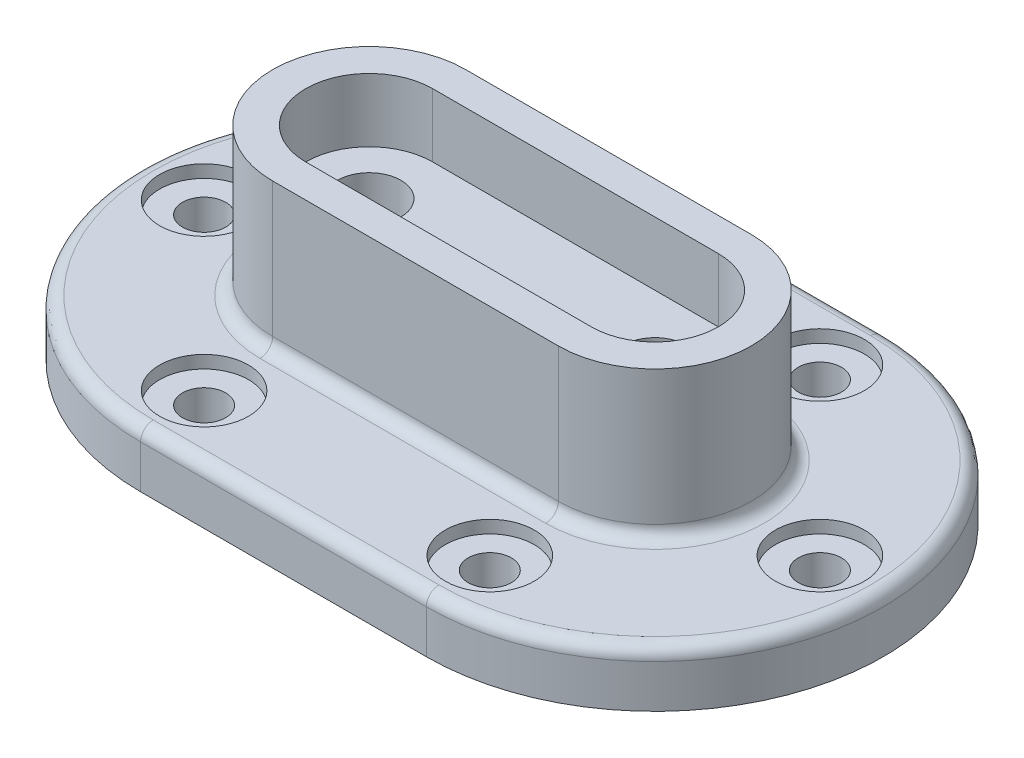
ISO-10303-21;
HEADER;
FILE_DESCRIPTION(('STEP AP214'),'2;1');
FILE_NAME('part.step','',(''),(''),'','','');
FILE_SCHEMA(('AUTOMOTIVE_DESIGN { 1 0 10303 214 1 1 1 1 }'));
ENDSEC;
DATA;
#1=APPLICATION_CONTEXT('core data for automotive mechanical design processes');
#2=APPLICATION_PROTOCOL_DEFINITION('international standard','automotive_design',2000,#1);
#3=PRODUCT_CONTEXT('',#1,'mechanical');
#4=PRODUCT('Part','Part','',(#3));
#5=PRODUCT_RELATED_PRODUCT_CATEGORY('part','',(#4));
#6=PRODUCT_DEFINITION_FORMATION('','',#4);
#7=PRODUCT_DEFINITION_CONTEXT('part definition',#1,'design');
#8=PRODUCT_DEFINITION('design','',#6,#7);
#9=PRODUCT_DEFINITION_SHAPE('','',#8);
#10=(LENGTH_UNIT() NAMED_UNIT(*) SI_UNIT(.MILLI.,.METRE.));
#11=(NAMED_UNIT(*) PLANE_ANGLE_UNIT() SI_UNIT($,.RADIAN.));
#12=(NAMED_UNIT(*) SI_UNIT($,.STERADIAN.) SOLID_ANGLE_UNIT());
#13=UNCERTAINTY_MEASURE_WITH_UNIT(LENGTH_MEASURE(1.E-05),#10,'distance_accuracy_value','');
#14=(GEOMETRIC_REPRESENTATION_CONTEXT(3) GLOBAL_UNCERTAINTY_ASSIGNED_CONTEXT((#13)) GLOBAL_UNIT_ASSIGNED_CONTEXT((#10,
#11,#12)) REPRESENTATION_CONTEXT('',''));
#15=CARTESIAN_POINT('',(0.,0.,0.));
#16=DIRECTION('',(0.,0.,1.));
#17=DIRECTION('',(1.,0.,0.));
#18=AXIS2_PLACEMENT_3D('',#15,#16,#17);
#19=CARTESIAN_POINT('',(-11.25,4.4,0.));
#20=DIRECTION('',(0.,1.,0.));
#21=DIRECTION('',(0.,0.,1.));
#22=AXIS2_PLACEMENT_3D('',#19,#20,#21);
#23=PLANE('',#22);
#24=DIRECTION('',(1.,0.,0.));
#25=VECTOR('',#24,1.);
#26=CARTESIAN_POINT('',(-11.25,4.4,8.6));
#27=LINE('',#26,#25);
#28=CARTESIAN_POINT('',(11.25,4.4,8.6));
#29=VERTEX_POINT('',#28);
#30=CARTESIAN_POINT('',(-11.25,4.4,8.6));
#31=VERTEX_POINT('',#30);
#32=EDGE_CURVE('E318',#29,#31,#27,.F.);
#33=ORIENTED_EDGE('',*,*,#32,.T.);
#34=CARTESIAN_POINT('',(-11.25,4.4,0.));
#35=DIRECTION('',(0.,1.,0.));
#36=DIRECTION('',(0.,0.,1.));
#37=AXIS2_PLACEMENT_3D('',#34,#35,#36);
#38=CIRCLE('',#37,8.6);
#39=CARTESIAN_POINT('',(-11.25,4.4,-8.6));
#40=VERTEX_POINT('',#39);
#41=EDGE_CURVE('E324',#31,#40,#38,.F.);
#42=ORIENTED_EDGE('',*,*,#41,.T.);
#43=DIRECTION('',(-1.,0.,0.));
#44=VECTOR('',#43,1.);
#45=CARTESIAN_POINT('',(-11.25,4.4,-8.6));
#46=LINE('',#45,#44);
#47=CARTESIAN_POINT('',(11.25,4.4,-8.6));
#48=VERTEX_POINT('',#47);
#49=EDGE_CURVE('E322',#40,#48,#46,.F.);
#50=ORIENTED_EDGE('',*,*,#49,.T.);
#51=CARTESIAN_POINT('',(11.25,4.4,0.));
#52=DIRECTION('',(0.,1.,0.));
#53=DIRECTION('',(0.,0.,1.));
#54=AXIS2_PLACEMENT_3D('',#51,#52,#53);
#55=CIRCLE('',#54,8.6);
#56=EDGE_CURVE('E320',#48,#29,#55,.F.);
#57=ORIENTED_EDGE('',*,*,#56,.T.);
#58=EDGE_LOOP('',(#33,#42,#50,#57));
#59=FACE_BOUND('',#58,.T.);
#60=DIRECTION('',(-1.,0.,0.));
#61=VECTOR('',#60,1.);
#62=CARTESIAN_POINT('',(-11.25,4.4,-17.));
#63=LINE('',#62,#61);
#64=CARTESIAN_POINT('',(11.25,4.4,-17.));
#65=VERTEX_POINT('',#64);
#66=CARTESIAN_POINT('',(-11.25,4.4,-17.));
#67=VERTEX_POINT('',#66);
#68=EDGE_CURVE('E313',#65,#67,#63,.T.);
#69=ORIENTED_EDGE('',*,*,#68,.T.);
#70=CARTESIAN_POINT('',(-11.25,4.4,0.));
#71=DIRECTION('',(0.,1.,0.));
#72=DIRECTION('',(0.,0.,1.));
#73=AXIS2_PLACEMENT_3D('',#70,#71,#72);
#74=CIRCLE('',#73,17.);
#75=CARTESIAN_POINT('',(-11.25,4.4,17.));
#76=VERTEX_POINT('',#75);
#77=EDGE_CURVE('E315',#67,#76,#74,.T.);
#78=ORIENTED_EDGE('',*,*,#77,.T.);
#79=DIRECTION('',(1.,0.,0.));
#80=VECTOR('',#79,1.);
#81=CARTESIAN_POINT('',(11.25,4.4,17.));
#82=LINE('',#81,#80);
#83=CARTESIAN_POINT('',(11.25,4.4,17.));
#84=VERTEX_POINT('',#83);
#85=EDGE_CURVE('E309',#76,#84,#82,.T.);
#86=ORIENTED_EDGE('',*,*,#85,.T.);
#87=CARTESIAN_POINT('',(11.25,4.4,0.));
#88=DIRECTION('',(0.,1.,0.));
#89=DIRECTION('',(0.,0.,1.));
#90=AXIS2_PLACEMENT_3D('',#87,#88,#89);
#91=CIRCLE('',#90,17.);
#92=EDGE_CURVE('E311',#84,#65,#91,.T.);
#93=ORIENTED_EDGE('',*,*,#92,.T.);
#94=EDGE_LOOP('',(#69,#78,#86,#93));
#95=FACE_BOUND('',#94,.T.);
#96=CARTESIAN_POINT('',(-11.25,4.4,-13.));
#97=DIRECTION('',(0.,1.,0.));
#98=DIRECTION('',(0.,0.,1.));
#99=AXIS2_PLACEMENT_3D('',#96,#97,#98);
#100=CIRCLE('',#99,3.5);
#101=CARTESIAN_POINT('',(-11.25,4.4,-9.5));
#102=VERTEX_POINT('',#101);
#103=EDGE_CURVE('E235',#102,#102,#100,.T.);
#104=ORIENTED_EDGE('',*,*,#103,.F.);
#105=EDGE_LOOP('',(#104));
#106=FACE_BOUND('',#105,.T.);
#107=CARTESIAN_POINT('',(11.25,4.4,-13.));
#108=DIRECTION('',(0.,1.,0.));
#109=DIRECTION('',(0.,0.,1.));
#110=AXIS2_PLACEMENT_3D('',#107,#108,#109);
#111=CIRCLE('',#110,3.5);
#112=CARTESIAN_POINT('',(11.25,4.4,-9.5));
#113=VERTEX_POINT('',#112);
#114=EDGE_CURVE('E242',#113,#113,#111,.T.);
#115=ORIENTED_EDGE('',*,*,#114,.F.);
#116=EDGE_LOOP('',(#115));
#117=FACE_BOUND('',#116,.T.);
#118=CARTESIAN_POINT('',(24.25,4.4,0.));
#119=DIRECTION('',(0.,1.,0.));
#120=DIRECTION('',(0.,0.,1.));
#121=AXIS2_PLACEMENT_3D('',#118,#119,#120);
#122=CIRCLE('',#121,3.5);
#123=CARTESIAN_POINT('',(24.25,4.4,3.5));
#124=VERTEX_POINT('',#123);
#125=EDGE_CURVE('E248',#124,#124,#122,.T.);
#126=ORIENTED_EDGE('',*,*,#125,.F.);
#127=EDGE_LOOP('',(#126));
#128=FACE_BOUND('',#127,.T.);
#129=CARTESIAN_POINT('',(11.2500000000001,4.4,13.));
#130=DIRECTION('',(0.,1.,0.));
#131=DIRECTION('',(0.,0.,1.));
#132=AXIS2_PLACEMENT_3D('',#129,#130,#131);
#133=CIRCLE('',#132,3.5);
#134=CARTESIAN_POINT('',(11.2500000000001,4.4,16.5));
#135=VERTEX_POINT('',#134);
#136=EDGE_CURVE('E254',#135,#135,#133,.T.);
#137=ORIENTED_EDGE('',*,*,#136,.F.);
#138=EDGE_LOOP('',(#137));
#139=FACE_BOUND('',#138,.T.);
#140=CARTESIAN_POINT('',(-11.2499999999999,4.4,13.));
#141=DIRECTION('',(0.,1.,0.));
#142=DIRECTION('',(0.,0.,1.));
#143=AXIS2_PLACEMENT_3D('',#140,#141,#142);
#144=CIRCLE('',#143,3.5);
#145=CARTESIAN_POINT('',(-11.2499999999999,4.4,16.5));
#146=VERTEX_POINT('',#145);
#147=EDGE_CURVE('E260',#146,#146,#144,.T.);
#148=ORIENTED_EDGE('',*,*,#147,.F.);
#149=EDGE_LOOP('',(#148));
#150=FACE_BOUND('',#149,.T.);
#151=CARTESIAN_POINT('',(-24.25,4.4,0.));
#152=DIRECTION('',(0.,1.,0.));
#153=DIRECTION('',(0.,0.,1.));
#154=AXIS2_PLACEMENT_3D('',#151,#152,#153);
#155=CIRCLE('',#154,3.5);
#156=CARTESIAN_POINT('',(-24.25,4.4,3.5));
#157=VERTEX_POINT('',#156);
#158=EDGE_CURVE('E238',#157,#157,#155,.T.);
#159=ORIENTED_EDGE('',*,*,#158,.F.);
#160=EDGE_LOOP('',(#159));
#161=FACE_BOUND('',#160,.T.);
#162=ADVANCED_FACE('F35',(#59,#95,#106,#117,#128,#139,#150,#161),#23,.T.);
#163=CARTESIAN_POINT('',(-11.25,4.4,0.));
#164=DIRECTION('',(0.,-1.,0.));
#165=DIRECTION('',(0.,0.,-1.));
#166=AXIS2_PLACEMENT_3D('',#163,#164,#165);
#167=CYLINDRICAL_SURFACE('',#166,18.);
#168=DIRECTION('',(0.,-1.,0.));
#169=VECTOR('',#168,1.);
#170=CARTESIAN_POINT('',(-11.25,4.4,18.));
#171=LINE('',#170,#169);
#172=CARTESIAN_POINT('',(-11.25,3.4,18.));
#173=VERTEX_POINT('',#172);
#174=CARTESIAN_POINT('',(-11.25,0.,18.));
#175=VERTEX_POINT('',#174);
#176=EDGE_CURVE('E289',#173,#175,#171,.T.);
#177=ORIENTED_EDGE('',*,*,#176,.F.);
#178=CARTESIAN_POINT('',(-11.25,3.4,0.));
#179=DIRECTION('',(0.,1.,0.));
#180=DIRECTION('',(0.,0.,1.));
#181=AXIS2_PLACEMENT_3D('',#178,#179,#180);
#182=CIRCLE('',#181,18.);
#183=CARTESIAN_POINT('',(-11.25,3.4,-18.));
#184=VERTEX_POINT('',#183);
#185=EDGE_CURVE('E331',#173,#184,#182,.F.);
#186=ORIENTED_EDGE('',*,*,#185,.T.);
#187=DIRECTION('',(0.,-1.,0.));
#188=VECTOR('',#187,1.);
#189=CARTESIAN_POINT('',(-11.25,4.4,-18.));
#190=LINE('',#189,#188);
#191=CARTESIAN_POINT('',(-11.25,0.,-18.));
#192=VERTEX_POINT('',#191);
#193=EDGE_CURVE('E283',#184,#192,#190,.T.);
#194=ORIENTED_EDGE('',*,*,#193,.T.);
#195=CARTESIAN_POINT('',(-11.25,0.,0.));
#196=DIRECTION('',(0.,1.,0.));
#197=DIRECTION('',(0.,0.,1.));
#198=AXIS2_PLACEMENT_3D('',#195,#196,#197);
#199=CIRCLE('',#198,18.);
#200=EDGE_CURVE('E269',#192,#175,#199,.T.);
#201=ORIENTED_EDGE('',*,*,#200,.T.);
#202=EDGE_LOOP('',(#177,#186,#194,#201));
#203=FACE_BOUND('',#202,.T.);
#204=ADVANCED_FACE('F372',(#203),#167,.T.);
#205=CARTESIAN_POINT('',(-11.25,4.4,18.));
#206=DIRECTION('',(0.,0.,-1.));
#207=DIRECTION('',(-1.,0.,0.));
#208=AXIS2_PLACEMENT_3D('',#205,#206,#207);
#209=PLANE('',#208);
#210=DIRECTION('',(0.,-1.,0.));
#211=VECTOR('',#210,1.);
#212=CARTESIAN_POINT('',(11.25,4.4,18.));
#213=LINE('',#212,#211);
#214=CARTESIAN_POINT('',(11.25,3.4,18.));
#215=VERTEX_POINT('',#214);
#216=CARTESIAN_POINT('',(11.25,0.,18.));
#217=VERTEX_POINT('',#216);
#218=EDGE_CURVE('E287',#215,#217,#213,.T.);
#219=ORIENTED_EDGE('',*,*,#218,.F.);
#220=DIRECTION('',(1.,0.,0.));
#221=VECTOR('',#220,1.);
#222=CARTESIAN_POINT('',(-11.25,3.4,18.));
#223=LINE('',#222,#221);
#224=EDGE_CURVE('E11',#215,#173,#223,.F.);
#225=ORIENTED_EDGE('',*,*,#224,.T.);
#226=ORIENTED_EDGE('',*,*,#176,.T.);
#227=DIRECTION('',(1.,0.,0.));
#228=VECTOR('',#227,1.);
#229=CARTESIAN_POINT('',(-11.25,0.,18.));
#230=LINE('',#229,#228);
#231=EDGE_CURVE('E274',#175,#217,#230,.T.);
#232=ORIENTED_EDGE('',*,*,#231,.T.);
#233=EDGE_LOOP('',(#219,#225,#226,#232));
#234=FACE_BOUND('',#233,.T.);
#235=ADVANCED_FACE('F368',(#234),#209,.F.);
#236=CARTESIAN_POINT('',(11.25,4.4,0.));
#237=DIRECTION('',(0.,-1.,0.));
#238=DIRECTION('',(0.,0.,-1.));
#239=AXIS2_PLACEMENT_3D('',#236,#237,#238);
#240=CYLINDRICAL_SURFACE('',#239,18.);
#241=DIRECTION('',(0.,-1.,0.));
#242=VECTOR('',#241,1.);
#243=CARTESIAN_POINT('',(11.25,4.4,-18.));
#244=LINE('',#243,#242);
#245=CARTESIAN_POINT('',(11.25,3.4,-18.));
#246=VERTEX_POINT('',#245);
#247=CARTESIAN_POINT('',(11.25,0.,-18.));
#248=VERTEX_POINT('',#247);
#249=EDGE_CURVE('E285',#246,#248,#244,.T.);
#250=ORIENTED_EDGE('',*,*,#249,.F.);
#251=CARTESIAN_POINT('',(11.25,3.4,0.));
#252=DIRECTION('',(0.,1.,0.));
#253=DIRECTION('',(0.,0.,1.));
#254=AXIS2_PLACEMENT_3D('',#251,#252,#253);
#255=CIRCLE('',#254,18.);
#256=EDGE_CURVE('E60',#246,#215,#255,.F.);
#257=ORIENTED_EDGE('',*,*,#256,.T.);
#258=ORIENTED_EDGE('',*,*,#218,.T.);
#259=CARTESIAN_POINT('',(11.25,0.,0.));
#260=DIRECTION('',(0.,1.,0.));
#261=DIRECTION('',(0.,0.,1.));
#262=AXIS2_PLACEMENT_3D('',#259,#260,#261);
#263=CIRCLE('',#262,18.);
#264=EDGE_CURVE('E277',#217,#248,#263,.T.);
#265=ORIENTED_EDGE('',*,*,#264,.T.);
#266=EDGE_LOOP('',(#250,#257,#258,#265));
#267=FACE_BOUND('',#266,.T.);
#268=ADVANCED_FACE('F416',(#267),#240,.T.);
#269=CARTESIAN_POINT('',(-11.25,4.4,-18.));
#270=DIRECTION('',(0.,0.,1.));
#271=DIRECTION('',(1.,0.,0.));
#272=AXIS2_PLACEMENT_3D('',#269,#270,#271);
#273=PLANE('',#272);
#274=ORIENTED_EDGE('',*,*,#193,.F.);
#275=DIRECTION('',(-1.,0.,0.));
#276=VECTOR('',#275,1.);
#277=CARTESIAN_POINT('',(11.25,3.4,-18.));
#278=LINE('',#277,#276);
#279=EDGE_CURVE('E334',#184,#246,#278,.F.);
#280=ORIENTED_EDGE('',*,*,#279,.T.);
#281=ORIENTED_EDGE('',*,*,#249,.T.);
#282=DIRECTION('',(-1.,0.,0.));
#283=VECTOR('',#282,1.);
#284=CARTESIAN_POINT('',(-11.25,0.,-18.));
#285=LINE('',#284,#283);
#286=EDGE_CURVE('E280',#248,#192,#285,.T.);
#287=ORIENTED_EDGE('',*,*,#286,.T.);
#288=EDGE_LOOP('',(#274,#280,#281,#287));
#289=FACE_BOUND('',#288,.T.);
#290=ADVANCED_FACE('F408',(#289),#273,.F.);
#291=CARTESIAN_POINT('',(-11.25,0.,0.));
#292=DIRECTION('',(0.,1.,0.));
#293=DIRECTION('',(0.,0.,1.));
#294=AXIS2_PLACEMENT_3D('',#291,#292,#293);
#295=PLANE('',#294);
#296=CARTESIAN_POINT('',(11.25,0.,0.));
#297=DIRECTION('',(0.,1.,0.));
#298=DIRECTION('',(0.,0.,1.));
#299=AXIS2_PLACEMENT_3D('',#296,#297,#298);
#300=CIRCLE('',#299,2.5);
#301=CARTESIAN_POINT('',(11.25,0.,2.5));
#302=VERTEX_POINT('',#301);
#303=EDGE_CURVE('E787',#302,#302,#300,.F.);
#304=ORIENTED_EDGE('',*,*,#303,.F.);
#305=EDGE_LOOP('',(#304));
#306=FACE_BOUND('',#305,.T.);
#307=CARTESIAN_POINT('',(-11.25,0.,0.));
#308=DIRECTION('',(0.,1.,0.));
#309=DIRECTION('',(0.,0.,1.));
#310=AXIS2_PLACEMENT_3D('',#307,#308,#309);
#311=CIRCLE('',#310,2.5);
#312=CARTESIAN_POINT('',(-11.25,0.,2.5));
#313=VERTEX_POINT('',#312);
#314=EDGE_CURVE('E176',#313,#313,#311,.F.);
#315=ORIENTED_EDGE('',*,*,#314,.F.);
#316=EDGE_LOOP('',(#315));
#317=FACE_BOUND('',#316,.T.);
#318=CARTESIAN_POINT('',(-11.25,0.,-13.));
#319=DIRECTION('',(0.,1.,0.));
#320=DIRECTION('',(0.,0.,1.));
#321=AXIS2_PLACEMENT_3D('',#318,#319,#320);
#322=CIRCLE('',#321,1.7);
#323=CARTESIAN_POINT('',(-11.25,0.,-11.3));
#324=VERTEX_POINT('',#323);
#325=EDGE_CURVE('E215',#324,#324,#322,.T.);
#326=ORIENTED_EDGE('',*,*,#325,.T.);
#327=EDGE_LOOP('',(#326));
#328=FACE_BOUND('',#327,.T.);
#329=CARTESIAN_POINT('',(11.25,0.,-13.));
#330=DIRECTION('',(0.,1.,0.));
#331=DIRECTION('',(0.,0.,1.));
#332=AXIS2_PLACEMENT_3D('',#329,#330,#331);
#333=CIRCLE('',#332,1.7);
#334=CARTESIAN_POINT('',(11.25,0.,-11.3));
#335=VERTEX_POINT('',#334);
#336=EDGE_CURVE('E219',#335,#335,#333,.T.);
#337=ORIENTED_EDGE('',*,*,#336,.T.);
#338=EDGE_LOOP('',(#337));
#339=FACE_BOUND('',#338,.T.);
#340=CARTESIAN_POINT('',(24.25,0.,0.));
#341=DIRECTION('',(0.,1.,0.));
#342=DIRECTION('',(0.,0.,1.));
#343=AXIS2_PLACEMENT_3D('',#340,#341,#342);
#344=CIRCLE('',#343,1.7);
#345=CARTESIAN_POINT('',(24.25,0.,1.7));
#346=VERTEX_POINT('',#345);
#347=EDGE_CURVE('E222',#346,#346,#344,.T.);
#348=ORIENTED_EDGE('',*,*,#347,.T.);
#349=EDGE_LOOP('',(#348));
#350=FACE_BOUND('',#349,.T.);
#351=CARTESIAN_POINT('',(11.2500000000001,0.,13.));
#352=DIRECTION('',(0.,1.,0.));
#353=DIRECTION('',(0.,0.,1.));
#354=AXIS2_PLACEMENT_3D('',#351,#352,#353);
#355=CIRCLE('',#354,1.7);
#356=CARTESIAN_POINT('',(11.2500000000001,0.,14.7));
#357=VERTEX_POINT('',#356);
#358=EDGE_CURVE('E225',#357,#357,#355,.T.);
#359=ORIENTED_EDGE('',*,*,#358,.T.);
#360=EDGE_LOOP('',(#359));
#361=FACE_BOUND('',#360,.T.);
#362=CARTESIAN_POINT('',(-11.2499999999999,0.,13.));
#363=DIRECTION('',(0.,1.,0.));
#364=DIRECTION('',(0.,0.,1.));
#365=AXIS2_PLACEMENT_3D('',#362,#363,#364);
#366=CIRCLE('',#365,1.7);
#367=CARTESIAN_POINT('',(-11.2499999999999,0.,14.7));
#368=VERTEX_POINT('',#367);
#369=EDGE_CURVE('E214',#368,#368,#366,.T.);
#370=ORIENTED_EDGE('',*,*,#369,.T.);
#371=EDGE_LOOP('',(#370));
#372=FACE_BOUND('',#371,.T.);
#373=CARTESIAN_POINT('',(-24.25,0.,0.));
#374=DIRECTION('',(0.,1.,0.));
#375=DIRECTION('',(0.,0.,1.));
#376=AXIS2_PLACEMENT_3D('',#373,#374,#375);
#377=CIRCLE('',#376,1.7);
#378=CARTESIAN_POINT('',(-24.25,0.,1.7));
#379=VERTEX_POINT('',#378);
#380=EDGE_CURVE('E230',#379,#379,#377,.T.);
#381=ORIENTED_EDGE('',*,*,#380,.T.);
#382=EDGE_LOOP('',(#381));
#383=FACE_BOUND('',#382,.T.);
#384=ORIENTED_EDGE('',*,*,#200,.F.);
#385=ORIENTED_EDGE('',*,*,#286,.F.);
#386=ORIENTED_EDGE('',*,*,#264,.F.);
#387=ORIENTED_EDGE('',*,*,#231,.F.);
#388=EDGE_LOOP('',(#384,#385,#386,#387));
#389=FACE_BOUND('',#388,.T.);
#390=ADVANCED_FACE('F398',(#306,#317,#328,#339,#350,#361,#372,#383,#389),#295,.F.);
#391=CARTESIAN_POINT('',(-24.25,3.4,0.));
#392=DIRECTION('',(0.,1.,0.));
#393=DIRECTION('',(0.,0.,1.));
#394=AXIS2_PLACEMENT_3D('',#391,#392,#393);
#395=CYLINDRICAL_SURFACE('',#394,3.5);
#396=CARTESIAN_POINT('',(-24.25,3.4,0.));
#397=DIRECTION('',(0.,1.,0.));
#398=DIRECTION('',(0.,0.,1.));
#399=AXIS2_PLACEMENT_3D('',#396,#397,#398);
#400=CIRCLE('',#399,3.5);
#401=CARTESIAN_POINT('',(-24.25,3.4,3.5));
#402=VERTEX_POINT('',#401);
#403=EDGE_CURVE('E266',#402,#402,#400,.T.);
#404=ORIENTED_EDGE('',*,*,#403,.F.);
#405=EDGE_LOOP('',(#404));
#406=FACE_BOUND('',#405,.T.);
#407=ORIENTED_EDGE('',*,*,#158,.T.);
#408=EDGE_LOOP('',(#407));
#409=FACE_BOUND('',#408,.T.);
#410=ADVANCED_FACE('F395',(#406,#409),#395,.F.);
#411=CARTESIAN_POINT('',(-24.25,3.4,0.));
#412=DIRECTION('',(0.,1.,0.));
#413=DIRECTION('',(0.,0.,1.));
#414=AXIS2_PLACEMENT_3D('',#411,#412,#413);
#415=PLANE('',#414);
#416=CARTESIAN_POINT('',(-24.25,3.4,0.));
#417=DIRECTION('',(0.,1.,0.));
#418=DIRECTION('',(0.,0.,1.));
#419=AXIS2_PLACEMENT_3D('',#416,#417,#418);
#420=CIRCLE('',#419,1.7);
#421=CARTESIAN_POINT('',(-24.25,3.4,1.7));
#422=VERTEX_POINT('',#421);
#423=EDGE_CURVE('E233',#422,#422,#420,.T.);
#424=ORIENTED_EDGE('',*,*,#423,.F.);
#425=EDGE_LOOP('',(#424));
#426=FACE_BOUND('',#425,.T.);
#427=ORIENTED_EDGE('',*,*,#403,.T.);
#428=EDGE_LOOP('',(#427));
#429=FACE_BOUND('',#428,.T.);
#430=ADVANCED_FACE('F397',(#426,#429),#415,.T.);
#431=CARTESIAN_POINT('',(-11.2499999999999,3.4,13.));
#432=DIRECTION('',(0.,1.,0.));
#433=DIRECTION('',(0.,0.,1.));
#434=AXIS2_PLACEMENT_3D('',#431,#432,#433);
#435=CYLINDRICAL_SURFACE('',#434,3.5);
#436=CARTESIAN_POINT('',(-11.2499999999999,3.4,13.));
#437=DIRECTION('',(0.,1.,0.));
#438=DIRECTION('',(0.,0.,1.));
#439=AXIS2_PLACEMENT_3D('',#436,#437,#438);
#440=CIRCLE('',#439,3.5);
#441=CARTESIAN_POINT('',(-11.2499999999999,3.4,16.5));
#442=VERTEX_POINT('',#441);
#443=EDGE_CURVE('E263',#442,#442,#440,.T.);
#444=ORIENTED_EDGE('',*,*,#443,.F.);
#445=EDGE_LOOP('',(#444));
#446=FACE_BOUND('',#445,.T.);
#447=ORIENTED_EDGE('',*,*,#147,.T.);
#448=EDGE_LOOP('',(#447));
#449=FACE_BOUND('',#448,.T.);
#450=ADVANCED_FACE('F405',(#446,#449),#435,.F.);
#451=CARTESIAN_POINT('',(-11.2499999999999,3.4,13.));
#452=DIRECTION('',(0.,1.,0.));
#453=DIRECTION('',(0.,0.,1.));
#454=AXIS2_PLACEMENT_3D('',#451,#452,#453);
#455=PLANE('',#454);
#456=CARTESIAN_POINT('',(-11.2499999999999,3.4,13.));
#457=DIRECTION('',(0.,1.,0.));
#458=DIRECTION('',(0.,0.,1.));
#459=AXIS2_PLACEMENT_3D('',#456,#457,#458);
#460=CIRCLE('',#459,1.7);
#461=CARTESIAN_POINT('',(-11.2499999999999,3.4,14.7));
#462=VERTEX_POINT('',#461);
#463=EDGE_CURVE('E234',#462,#462,#460,.T.);
#464=ORIENTED_EDGE('',*,*,#463,.F.);
#465=EDGE_LOOP('',(#464));
#466=FACE_BOUND('',#465,.T.);
#467=ORIENTED_EDGE('',*,*,#443,.T.);
#468=EDGE_LOOP('',(#467));
#469=FACE_BOUND('',#468,.T.);
#470=ADVANCED_FACE('F622',(#466,#469),#455,.T.);
#471=CARTESIAN_POINT('',(11.2500000000001,3.4,13.));
#472=DIRECTION('',(0.,1.,0.));
#473=DIRECTION('',(0.,0.,1.));
#474=AXIS2_PLACEMENT_3D('',#471,#472,#473);
#475=CYLINDRICAL_SURFACE('',#474,3.5);
#476=CARTESIAN_POINT('',(11.2500000000001,3.4,13.));
#477=DIRECTION('',(0.,1.,0.));
#478=DIRECTION('',(0.,0.,1.));
#479=AXIS2_PLACEMENT_3D('',#476,#477,#478);
#480=CIRCLE('',#479,3.5);
#481=CARTESIAN_POINT('',(11.2500000000001,3.4,16.5));
#482=VERTEX_POINT('',#481);
#483=EDGE_CURVE('E257',#482,#482,#480,.T.);
#484=ORIENTED_EDGE('',*,*,#483,.F.);
#485=EDGE_LOOP('',(#484));
#486=FACE_BOUND('',#485,.T.);
#487=ORIENTED_EDGE('',*,*,#136,.T.);
#488=EDGE_LOOP('',(#487));
#489=FACE_BOUND('',#488,.T.);
#490=ADVANCED_FACE('F614',(#486,#489),#475,.F.);
#491=CARTESIAN_POINT('',(11.2500000000001,3.4,13.));
#492=DIRECTION('',(0.,1.,0.));
#493=DIRECTION('',(0.,0.,1.));
#494=AXIS2_PLACEMENT_3D('',#491,#492,#493);
#495=PLANE('',#494);
#496=CARTESIAN_POINT('',(11.2500000000001,3.4,13.));
#497=DIRECTION('',(0.,1.,0.));
#498=DIRECTION('',(0.,0.,1.));
#499=AXIS2_PLACEMENT_3D('',#496,#497,#498);
#500=CIRCLE('',#499,1.7);
#501=CARTESIAN_POINT('',(11.2500000000001,3.4,14.7));
#502=VERTEX_POINT('',#501);
#503=EDGE_CURVE('E302',#502,#502,#500,.T.);
#504=ORIENTED_EDGE('',*,*,#503,.F.);
#505=EDGE_LOOP('',(#504));
#506=FACE_BOUND('',#505,.T.);
#507=ORIENTED_EDGE('',*,*,#483,.T.);
#508=EDGE_LOOP('',(#507));
#509=FACE_BOUND('',#508,.T.);
#510=ADVANCED_FACE('F606',(#506,#509),#495,.T.);
#511=CARTESIAN_POINT('',(24.25,3.4,0.));
#512=DIRECTION('',(0.,1.,0.));
#513=DIRECTION('',(0.,0.,1.));
#514=AXIS2_PLACEMENT_3D('',#511,#512,#513);
#515=CYLINDRICAL_SURFACE('',#514,3.5);
#516=CARTESIAN_POINT('',(24.25,3.4,0.));
#517=DIRECTION('',(0.,1.,0.));
#518=DIRECTION('',(0.,0.,1.));
#519=AXIS2_PLACEMENT_3D('',#516,#517,#518);
#520=CIRCLE('',#519,3.5);
#521=CARTESIAN_POINT('',(24.25,3.4,3.5));
#522=VERTEX_POINT('',#521);
#523=EDGE_CURVE('E251',#522,#522,#520,.T.);
#524=ORIENTED_EDGE('',*,*,#523,.F.);
#525=EDGE_LOOP('',(#524));
#526=FACE_BOUND('',#525,.T.);
#527=ORIENTED_EDGE('',*,*,#125,.T.);
#528=EDGE_LOOP('',(#527));
#529=FACE_BOUND('',#528,.T.);
#530=ADVANCED_FACE('F598',(#526,#529),#515,.F.);
#531=CARTESIAN_POINT('',(24.25,3.4,0.));
#532=DIRECTION('',(0.,1.,0.));
#533=DIRECTION('',(0.,0.,1.));
#534=AXIS2_PLACEMENT_3D('',#531,#532,#533);
#535=PLANE('',#534);
#536=CARTESIAN_POINT('',(24.25,3.4,0.));
#537=DIRECTION('',(0.,1.,0.));
#538=DIRECTION('',(0.,0.,1.));
#539=AXIS2_PLACEMENT_3D('',#536,#537,#538);
#540=CIRCLE('',#539,1.7);
#541=CARTESIAN_POINT('',(24.25,3.4,1.7));
#542=VERTEX_POINT('',#541);
#543=EDGE_CURVE('E299',#542,#542,#540,.T.);
#544=ORIENTED_EDGE('',*,*,#543,.F.);
#545=EDGE_LOOP('',(#544));
#546=FACE_BOUND('',#545,.T.);
#547=ORIENTED_EDGE('',*,*,#523,.T.);
#548=EDGE_LOOP('',(#547));
#549=FACE_BOUND('',#548,.T.);
#550=ADVANCED_FACE('F590',(#546,#549),#535,.T.);
#551=CARTESIAN_POINT('',(11.25,3.4,-13.));
#552=DIRECTION('',(0.,1.,0.));
#553=DIRECTION('',(0.,0.,1.));
#554=AXIS2_PLACEMENT_3D('',#551,#552,#553);
#555=CYLINDRICAL_SURFACE('',#554,3.5);
#556=CARTESIAN_POINT('',(11.25,3.4,-13.));
#557=DIRECTION('',(0.,1.,0.));
#558=DIRECTION('',(0.,0.,1.));
#559=AXIS2_PLACEMENT_3D('',#556,#557,#558);
#560=CIRCLE('',#559,3.5);
#561=CARTESIAN_POINT('',(11.25,3.4,-9.5));
#562=VERTEX_POINT('',#561);
#563=EDGE_CURVE('E245',#562,#562,#560,.T.);
#564=ORIENTED_EDGE('',*,*,#563,.F.);
#565=EDGE_LOOP('',(#564));
#566=FACE_BOUND('',#565,.T.);
#567=ORIENTED_EDGE('',*,*,#114,.T.);
#568=EDGE_LOOP('',(#567));
#569=FACE_BOUND('',#568,.T.);
#570=ADVANCED_FACE('F582',(#566,#569),#555,.F.);
#571=CARTESIAN_POINT('',(11.25,3.4,-13.));
#572=DIRECTION('',(0.,1.,0.));
#573=DIRECTION('',(0.,0.,1.));
#574=AXIS2_PLACEMENT_3D('',#571,#572,#573);
#575=PLANE('',#574);
#576=CARTESIAN_POINT('',(11.25,3.4,-13.));
#577=DIRECTION('',(0.,1.,0.));
#578=DIRECTION('',(0.,0.,1.));
#579=AXIS2_PLACEMENT_3D('',#576,#577,#578);
#580=CIRCLE('',#579,1.7);
#581=CARTESIAN_POINT('',(11.25,3.4,-11.3));
#582=VERTEX_POINT('',#581);
#583=EDGE_CURVE('E296',#582,#582,#580,.T.);
#584=ORIENTED_EDGE('',*,*,#583,.F.);
#585=EDGE_LOOP('',(#584));
#586=FACE_BOUND('',#585,.T.);
#587=ORIENTED_EDGE('',*,*,#563,.T.);
#588=EDGE_LOOP('',(#587));
#589=FACE_BOUND('',#588,.T.);
#590=ADVANCED_FACE('F573',(#586,#589),#575,.T.);
#591=CARTESIAN_POINT('',(-11.25,3.4,-13.));
#592=DIRECTION('',(0.,1.,0.));
#593=DIRECTION('',(0.,0.,1.));
#594=AXIS2_PLACEMENT_3D('',#591,#592,#593);
#595=CYLINDRICAL_SURFACE('',#594,3.5);
#596=CARTESIAN_POINT('',(-11.25,3.4,-13.));
#597=DIRECTION('',(0.,1.,0.));
#598=DIRECTION('',(0.,0.,1.));
#599=AXIS2_PLACEMENT_3D('',#596,#597,#598);
#600=CIRCLE('',#599,3.5);
#601=CARTESIAN_POINT('',(-11.25,3.4,-9.5));
#602=VERTEX_POINT('',#601);
#603=EDGE_CURVE('E239',#602,#602,#600,.T.);
#604=ORIENTED_EDGE('',*,*,#603,.F.);
#605=EDGE_LOOP('',(#604));
#606=FACE_BOUND('',#605,.T.);
#607=ORIENTED_EDGE('',*,*,#103,.T.);
#608=EDGE_LOOP('',(#607));
#609=FACE_BOUND('',#608,.T.);
#610=ADVANCED_FACE('F564',(#606,#609),#595,.F.);
#611=CARTESIAN_POINT('',(-11.25,3.4,-13.));
#612=DIRECTION('',(0.,1.,0.));
#613=DIRECTION('',(0.,0.,1.));
#614=AXIS2_PLACEMENT_3D('',#611,#612,#613);
#615=PLANE('',#614);
#616=CARTESIAN_POINT('',(-11.25,3.4,-13.));
#617=DIRECTION('',(0.,1.,0.));
#618=DIRECTION('',(0.,0.,1.));
#619=AXIS2_PLACEMENT_3D('',#616,#617,#618);
#620=CIRCLE('',#619,1.7);
#621=CARTESIAN_POINT('',(-11.25,3.4,-11.3));
#622=VERTEX_POINT('',#621);
#623=EDGE_CURVE('E218',#622,#622,#620,.T.);
#624=ORIENTED_EDGE('',*,*,#623,.F.);
#625=EDGE_LOOP('',(#624));
#626=FACE_BOUND('',#625,.T.);
#627=ORIENTED_EDGE('',*,*,#603,.T.);
#628=EDGE_LOOP('',(#627));
#629=FACE_BOUND('',#628,.T.);
#630=ADVANCED_FACE('F556',(#626,#629),#615,.T.);
#631=CARTESIAN_POINT('',(-24.25,0.,0.));
#632=DIRECTION('',(0.,1.,0.));
#633=DIRECTION('',(0.,0.,1.));
#634=AXIS2_PLACEMENT_3D('',#631,#632,#633);
#635=CYLINDRICAL_SURFACE('',#634,1.7);
#636=ORIENTED_EDGE('',*,*,#423,.T.);
#637=EDGE_LOOP('',(#636));
#638=FACE_BOUND('',#637,.T.);
#639=ORIENTED_EDGE('',*,*,#380,.F.);
#640=EDGE_LOOP('',(#639));
#641=FACE_BOUND('',#640,.T.);
#642=ADVANCED_FACE('F548',(#638,#641),#635,.F.);
#643=CARTESIAN_POINT('',(-11.25,0.,-13.));
#644=DIRECTION('',(0.,1.,0.));
#645=DIRECTION('',(0.,0.,1.));
#646=AXIS2_PLACEMENT_3D('',#643,#644,#645);
#647=CYLINDRICAL_SURFACE('',#646,1.7);
#648=ORIENTED_EDGE('',*,*,#623,.T.);
#649=EDGE_LOOP('',(#648));
#650=FACE_BOUND('',#649,.T.);
#651=ORIENTED_EDGE('',*,*,#325,.F.);
#652=EDGE_LOOP('',(#651));
#653=FACE_BOUND('',#652,.T.);
#654=ADVANCED_FACE('F540',(#650,#653),#647,.F.);
#655=CARTESIAN_POINT('',(11.25,0.,-13.));
#656=DIRECTION('',(0.,1.,0.));
#657=DIRECTION('',(0.,0.,1.));
#658=AXIS2_PLACEMENT_3D('',#655,#656,#657);
#659=CYLINDRICAL_SURFACE('',#658,1.7);
#660=ORIENTED_EDGE('',*,*,#583,.T.);
#661=EDGE_LOOP('',(#660));
#662=FACE_BOUND('',#661,.T.);
#663=ORIENTED_EDGE('',*,*,#336,.F.);
#664=EDGE_LOOP('',(#663));
#665=FACE_BOUND('',#664,.T.);
#666=ADVANCED_FACE('F532',(#662,#665),#659,.F.);
#667=CARTESIAN_POINT('',(24.25,0.,0.));
#668=DIRECTION('',(0.,1.,0.));
#669=DIRECTION('',(0.,0.,1.));
#670=AXIS2_PLACEMENT_3D('',#667,#668,#669);
#671=CYLINDRICAL_SURFACE('',#670,1.7);
#672=ORIENTED_EDGE('',*,*,#543,.T.);
#673=EDGE_LOOP('',(#672));
#674=FACE_BOUND('',#673,.T.);
#675=ORIENTED_EDGE('',*,*,#347,.F.);
#676=EDGE_LOOP('',(#675));
#677=FACE_BOUND('',#676,.T.);
#678=ADVANCED_FACE('F524',(#674,#677),#671,.F.);
#679=CARTESIAN_POINT('',(11.2500000000001,0.,13.));
#680=DIRECTION('',(0.,1.,0.));
#681=DIRECTION('',(0.,0.,1.));
#682=AXIS2_PLACEMENT_3D('',#679,#680,#681);
#683=CYLINDRICAL_SURFACE('',#682,1.7);
#684=ORIENTED_EDGE('',*,*,#503,.T.);
#685=EDGE_LOOP('',(#684));
#686=FACE_BOUND('',#685,.T.);
#687=ORIENTED_EDGE('',*,*,#358,.F.);
#688=EDGE_LOOP('',(#687));
#689=FACE_BOUND('',#688,.T.);
#690=ADVANCED_FACE('F515',(#686,#689),#683,.F.);
#691=CARTESIAN_POINT('',(-11.2499999999999,0.,13.));
#692=DIRECTION('',(0.,1.,0.));
#693=DIRECTION('',(0.,0.,1.));
#694=AXIS2_PLACEMENT_3D('',#691,#692,#693);
#695=CYLINDRICAL_SURFACE('',#694,1.7);
#696=ORIENTED_EDGE('',*,*,#463,.T.);
#697=EDGE_LOOP('',(#696));
#698=FACE_BOUND('',#697,.T.);
#699=ORIENTED_EDGE('',*,*,#369,.F.);
#700=EDGE_LOOP('',(#699));
#701=FACE_BOUND('',#700,.T.);
#702=ADVANCED_FACE('F506',(#698,#701),#695,.F.);
#703=CARTESIAN_POINT('',(-11.25,16.,0.));
#704=DIRECTION('',(0.,-1.,0.));
#705=DIRECTION('',(0.,0.,-1.));
#706=AXIS2_PLACEMENT_3D('',#703,#704,#705);
#707=CYLINDRICAL_SURFACE('',#706,7.6);
#708=DIRECTION('',(0.,-1.,0.));
#709=VECTOR('',#708,1.);
#710=CARTESIAN_POINT('',(-11.25,16.,-7.6));
#711=LINE('',#710,#709);
#712=CARTESIAN_POINT('',(-11.25,16.,-7.6));
#713=VERTEX_POINT('',#712);
#714=CARTESIAN_POINT('',(-11.25,5.4,-7.6));
#715=VERTEX_POINT('',#714);
#716=EDGE_CURVE('E202',#713,#715,#711,.T.);
#717=ORIENTED_EDGE('',*,*,#716,.T.);
#718=CARTESIAN_POINT('',(-11.25,5.4,0.));
#719=DIRECTION('',(0.,1.,0.));
#720=DIRECTION('',(0.,0.,1.));
#721=AXIS2_PLACEMENT_3D('',#718,#719,#720);
#722=CIRCLE('',#721,7.6);
#723=CARTESIAN_POINT('',(-11.25,5.4,7.6));
#724=VERTEX_POINT('',#723);
#725=EDGE_CURVE('E291',#715,#724,#722,.T.);
#726=ORIENTED_EDGE('',*,*,#725,.T.);
#727=DIRECTION('',(0.,-1.,0.));
#728=VECTOR('',#727,1.);
#729=CARTESIAN_POINT('',(-11.25,16.,7.6));
#730=LINE('',#729,#728);
#731=CARTESIAN_POINT('',(-11.25,16.,7.6));
#732=VERTEX_POINT('',#731);
#733=EDGE_CURVE('E211',#732,#724,#730,.T.);
#734=ORIENTED_EDGE('',*,*,#733,.F.);
#735=CARTESIAN_POINT('',(-11.25,16.,0.));
#736=DIRECTION('',(0.,1.,0.));
#737=DIRECTION('',(0.,0.,1.));
#738=AXIS2_PLACEMENT_3D('',#735,#736,#737);
#739=CIRCLE('',#738,7.6);
#740=EDGE_CURVE('E192',#713,#732,#739,.T.);
#741=ORIENTED_EDGE('',*,*,#740,.F.);
#742=EDGE_LOOP('',(#717,#726,#734,#741));
#743=FACE_BOUND('',#742,.T.);
#744=ADVANCED_FACE('F498',(#743),#707,.T.);
#745=CARTESIAN_POINT('',(-11.25,16.,7.6));
#746=DIRECTION('',(0.,0.,-1.));
#747=DIRECTION('',(-1.,0.,0.));
#748=AXIS2_PLACEMENT_3D('',#745,#746,#747);
#749=PLANE('',#748);
#750=ORIENTED_EDGE('',*,*,#733,.T.);
#751=DIRECTION('',(1.,0.,0.));
#752=VECTOR('',#751,1.);
#753=CARTESIAN_POINT('',(-11.25,5.4,7.6));
#754=LINE('',#753,#752);
#755=CARTESIAN_POINT('',(11.25,5.4,7.6));
#756=VERTEX_POINT('',#755);
#757=EDGE_CURVE('E44',#724,#756,#754,.T.);
#758=ORIENTED_EDGE('',*,*,#757,.T.);
#759=DIRECTION('',(0.,-1.,0.));
#760=VECTOR('',#759,1.);
#761=CARTESIAN_POINT('',(11.25,16.,7.6));
#762=LINE('',#761,#760);
#763=CARTESIAN_POINT('',(11.25,16.,7.6));
#764=VERTEX_POINT('',#763);
#765=EDGE_CURVE('E208',#764,#756,#762,.T.);
#766=ORIENTED_EDGE('',*,*,#765,.F.);
#767=DIRECTION('',(1.,0.,0.));
#768=VECTOR('',#767,1.);
#769=CARTESIAN_POINT('',(-11.25,16.,7.6));
#770=LINE('',#769,#768);
#771=EDGE_CURVE('E195',#732,#764,#770,.T.);
#772=ORIENTED_EDGE('',*,*,#771,.F.);
#773=EDGE_LOOP('',(#750,#758,#766,#772));
#774=FACE_BOUND('',#773,.T.);
#775=ADVANCED_FACE('F490',(#774),#749,.F.);
#776=CARTESIAN_POINT('',(11.25,16.,0.));
#777=DIRECTION('',(0.,-1.,0.));
#778=DIRECTION('',(0.,0.,-1.));
#779=AXIS2_PLACEMENT_3D('',#776,#777,#778);
#780=CYLINDRICAL_SURFACE('',#779,7.6);
#781=ORIENTED_EDGE('',*,*,#765,.T.);
#782=CARTESIAN_POINT('',(11.25,5.4,0.));
#783=DIRECTION('',(0.,1.,0.));
#784=DIRECTION('',(0.,0.,1.));
#785=AXIS2_PLACEMENT_3D('',#782,#783,#784);
#786=CIRCLE('',#785,7.6);
#787=CARTESIAN_POINT('',(11.25,5.4,-7.6));
#788=VERTEX_POINT('',#787);
#789=EDGE_CURVE('E329',#756,#788,#786,.T.);
#790=ORIENTED_EDGE('',*,*,#789,.T.);
#791=DIRECTION('',(0.,-1.,0.));
#792=VECTOR('',#791,1.);
#793=CARTESIAN_POINT('',(11.25,16.,-7.6));
#794=LINE('',#793,#792);
#795=CARTESIAN_POINT('',(11.25,16.,-7.6));
#796=VERTEX_POINT('',#795);
#797=EDGE_CURVE('E205',#796,#788,#794,.T.);
#798=ORIENTED_EDGE('',*,*,#797,.F.);
#799=CARTESIAN_POINT('',(11.25,16.,0.));
#800=DIRECTION('',(0.,1.,0.));
#801=DIRECTION('',(0.,0.,1.));
#802=AXIS2_PLACEMENT_3D('',#799,#800,#801);
#803=CIRCLE('',#802,7.6);
#804=EDGE_CURVE('E198',#764,#796,#803,.T.);
#805=ORIENTED_EDGE('',*,*,#804,.F.);
#806=EDGE_LOOP('',(#781,#790,#798,#805));
#807=FACE_BOUND('',#806,.T.);
#808=ADVANCED_FACE('F482',(#807),#780,.T.);
#809=CARTESIAN_POINT('',(-11.25,16.,-7.6));
#810=DIRECTION('',(0.,0.,1.));
#811=DIRECTION('',(1.,0.,0.));
#812=AXIS2_PLACEMENT_3D('',#809,#810,#811);
#813=PLANE('',#812);
#814=ORIENTED_EDGE('',*,*,#797,.T.);
#815=DIRECTION('',(-1.,0.,0.));
#816=VECTOR('',#815,1.);
#817=CARTESIAN_POINT('',(-11.25,5.4,-7.6));
#818=LINE('',#817,#816);
#819=EDGE_CURVE('E327',#788,#715,#818,.T.);
#820=ORIENTED_EDGE('',*,*,#819,.T.);
#821=ORIENTED_EDGE('',*,*,#716,.F.);
#822=DIRECTION('',(-1.,0.,0.));
#823=VECTOR('',#822,1.);
#824=CARTESIAN_POINT('',(-11.25,16.,-7.6));
#825=LINE('',#824,#823);
#826=EDGE_CURVE('E200',#796,#713,#825,.T.);
#827=ORIENTED_EDGE('',*,*,#826,.F.);
#828=EDGE_LOOP('',(#814,#820,#821,#827));
#829=FACE_BOUND('',#828,.T.);
#830=ADVANCED_FACE('F473',(#829),#813,.F.);
#831=CARTESIAN_POINT('',(-11.25,16.,0.));
#832=DIRECTION('',(0.,1.,0.));
#833=DIRECTION('',(0.,0.,1.));
#834=AXIS2_PLACEMENT_3D('',#831,#832,#833);
#835=PLANE('',#834);
#836=CARTESIAN_POINT('',(-11.25,16.,0.));
#837=DIRECTION('',(0.,1.,0.));
#838=DIRECTION('',(0.,0.,1.));
#839=AXIS2_PLACEMENT_3D('',#836,#837,#838);
#840=CIRCLE('',#839,5.);
#841=CARTESIAN_POINT('',(-11.25,16.,-5.));
#842=VERTEX_POINT('',#841);
#843=CARTESIAN_POINT('',(-11.25,16.,5.));
#844=VERTEX_POINT('',#843);
#845=EDGE_CURVE('E52',#842,#844,#840,.T.);
#846=ORIENTED_EDGE('',*,*,#845,.F.);
#847=DIRECTION('',(-1.,0.,0.));
#848=VECTOR('',#847,1.);
#849=CARTESIAN_POINT('',(-11.25,16.,-5.));
#850=LINE('',#849,#848);
#851=CARTESIAN_POINT('',(11.25,16.,-5.00000000000001));
#852=VERTEX_POINT('',#851);
#853=EDGE_CURVE('E170',#852,#842,#850,.T.);
#854=ORIENTED_EDGE('',*,*,#853,.F.);
#855=CARTESIAN_POINT('',(11.25,16.,0.));
#856=DIRECTION('',(0.,1.,0.));
#857=DIRECTION('',(0.,0.,1.));
#858=AXIS2_PLACEMENT_3D('',#855,#856,#857);
#859=CIRCLE('',#858,5.);
#860=CARTESIAN_POINT('',(11.25,16.,5.));
#861=VERTEX_POINT('',#860);
#862=EDGE_CURVE('E173',#861,#852,#859,.T.);
#863=ORIENTED_EDGE('',*,*,#862,.F.);
#864=DIRECTION('',(1.,0.,0.));
#865=VECTOR('',#864,1.);
#866=CARTESIAN_POINT('',(-11.25,16.,5.));
#867=LINE('',#866,#865);
#868=EDGE_CURVE('E182',#844,#861,#867,.T.);
#869=ORIENTED_EDGE('',*,*,#868,.F.);
#870=EDGE_LOOP('',(#846,#854,#863,#869));
#871=FACE_BOUND('',#870,.T.);
#872=ORIENTED_EDGE('',*,*,#740,.T.);
#873=ORIENTED_EDGE('',*,*,#771,.T.);
#874=ORIENTED_EDGE('',*,*,#804,.T.);
#875=ORIENTED_EDGE('',*,*,#826,.T.);
#876=EDGE_LOOP('',(#872,#873,#874,#875));
#877=FACE_BOUND('',#876,.T.);
#878=ADVANCED_FACE('F439',(#871,#877),#835,.T.);
#879=CARTESIAN_POINT('',(11.25,5.4,0.));
#880=DIRECTION('',(0.,1.,0.));
#881=DIRECTION('',(0.,0.,1.));
#882=AXIS2_PLACEMENT_3D('',#879,#880,#881);
#883=TOROIDAL_SURFACE('',#882,8.6,1.);
#884=CARTESIAN_POINT('',(11.25,5.4,8.6));
#885=DIRECTION('',(1.,0.,0.));
#886=DIRECTION('',(0.,0.,-1.));
#887=AXIS2_PLACEMENT_3D('',#884,#885,#886);
#888=CIRCLE('',#887,1.);
#889=EDGE_CURVE('E342',#29,#756,#888,.T.);
#890=ORIENTED_EDGE('',*,*,#889,.F.);
#891=ORIENTED_EDGE('',*,*,#56,.F.);
#892=CARTESIAN_POINT('',(11.25,5.4,-8.60000000000001));
#893=DIRECTION('',(1.,0.,0.));
#894=DIRECTION('',(0.,0.,-1.));
#895=AXIS2_PLACEMENT_3D('',#892,#893,#894);
#896=CIRCLE('',#895,1.);
#897=EDGE_CURVE('E196',#788,#48,#896,.T.);
#898=ORIENTED_EDGE('',*,*,#897,.F.);
#899=ORIENTED_EDGE('',*,*,#789,.F.);
#900=EDGE_LOOP('',(#890,#891,#898,#899));
#901=FACE_BOUND('',#900,.T.);
#902=ADVANCED_FACE('F435',(#901),#883,.F.);
#903=CARTESIAN_POINT('',(-11.25,5.4,-8.6));
#904=DIRECTION('',(-1.,0.,0.));
#905=DIRECTION('',(0.,0.,1.));
#906=AXIS2_PLACEMENT_3D('',#903,#904,#905);
#907=CYLINDRICAL_SURFACE('',#906,1.);
#908=ORIENTED_EDGE('',*,*,#897,.T.);
#909=ORIENTED_EDGE('',*,*,#49,.F.);
#910=CARTESIAN_POINT('',(-11.25,5.4,-8.6));
#911=DIRECTION('',(1.,0.,0.));
#912=DIRECTION('',(0.,0.,-1.));
#913=AXIS2_PLACEMENT_3D('',#910,#911,#912);
#914=CIRCLE('',#913,1.);
#915=EDGE_CURVE('E340',#715,#40,#914,.T.);
#916=ORIENTED_EDGE('',*,*,#915,.F.);
#917=ORIENTED_EDGE('',*,*,#819,.F.);
#918=EDGE_LOOP('',(#908,#909,#916,#917));
#919=FACE_BOUND('',#918,.T.);
#920=ADVANCED_FACE('F431',(#919),#907,.F.);
#921=CARTESIAN_POINT('',(-11.25,5.4,8.6));
#922=DIRECTION('',(1.,0.,0.));
#923=DIRECTION('',(0.,0.,-1.));
#924=AXIS2_PLACEMENT_3D('',#921,#922,#923);
#925=CYLINDRICAL_SURFACE('',#924,1.);
#926=ORIENTED_EDGE('',*,*,#889,.T.);
#927=ORIENTED_EDGE('',*,*,#757,.F.);
#928=CARTESIAN_POINT('',(-11.25,5.4,8.6));
#929=DIRECTION('',(1.,0.,0.));
#930=DIRECTION('',(0.,0.,-1.));
#931=AXIS2_PLACEMENT_3D('',#928,#929,#930);
#932=CIRCLE('',#931,1.);
#933=EDGE_CURVE('E338',#31,#724,#932,.T.);
#934=ORIENTED_EDGE('',*,*,#933,.F.);
#935=ORIENTED_EDGE('',*,*,#32,.F.);
#936=EDGE_LOOP('',(#926,#927,#934,#935));
#937=FACE_BOUND('',#936,.T.);
#938=ADVANCED_FACE('F427',(#937),#925,.F.);
#939=CARTESIAN_POINT('',(-11.25,5.4,0.));
#940=DIRECTION('',(0.,1.,0.));
#941=DIRECTION('',(0.,0.,1.));
#942=AXIS2_PLACEMENT_3D('',#939,#940,#941);
#943=TOROIDAL_SURFACE('',#942,8.6,1.);
#944=ORIENTED_EDGE('',*,*,#915,.T.);
#945=ORIENTED_EDGE('',*,*,#41,.F.);
#946=ORIENTED_EDGE('',*,*,#933,.T.);
#947=ORIENTED_EDGE('',*,*,#725,.F.);
#948=EDGE_LOOP('',(#944,#945,#946,#947));
#949=FACE_BOUND('',#948,.T.);
#950=ADVANCED_FACE('F424',(#949),#943,.F.);
#951=CARTESIAN_POINT('',(11.25,3.4,0.));
#952=DIRECTION('',(0.,1.,0.));
#953=DIRECTION('',(0.,0.,1.));
#954=AXIS2_PLACEMENT_3D('',#951,#952,#953);
#955=TOROIDAL_SURFACE('',#954,17.,1.);
#956=CARTESIAN_POINT('',(11.25,3.4,17.));
#957=DIRECTION('',(-1.,0.,0.));
#958=DIRECTION('',(0.,0.,1.));
#959=AXIS2_PLACEMENT_3D('',#956,#957,#958);
#960=CIRCLE('',#959,1.);
#961=EDGE_CURVE('E349',#215,#84,#960,.T.);
#962=ORIENTED_EDGE('',*,*,#961,.F.);
#963=ORIENTED_EDGE('',*,*,#256,.F.);
#964=CARTESIAN_POINT('',(11.25,3.4,-17.));
#965=DIRECTION('',(-1.,0.,0.));
#966=DIRECTION('',(0.,0.,1.));
#967=AXIS2_PLACEMENT_3D('',#964,#965,#966);
#968=CIRCLE('',#967,1.);
#969=EDGE_CURVE('E39',#65,#246,#968,.T.);
#970=ORIENTED_EDGE('',*,*,#969,.F.);
#971=ORIENTED_EDGE('',*,*,#92,.F.);
#972=EDGE_LOOP('',(#962,#963,#970,#971));
#973=FACE_BOUND('',#972,.T.);
#974=ADVANCED_FACE('F37',(#973),#955,.T.);
#975=CARTESIAN_POINT('',(-11.25,3.4,-17.));
#976=DIRECTION('',(1.,0.,0.));
#977=DIRECTION('',(0.,0.,-1.));
#978=AXIS2_PLACEMENT_3D('',#975,#976,#977);
#979=CYLINDRICAL_SURFACE('',#978,1.);
#980=ORIENTED_EDGE('',*,*,#969,.T.);
#981=ORIENTED_EDGE('',*,*,#279,.F.);
#982=CARTESIAN_POINT('',(-11.25,3.4,-17.));
#983=DIRECTION('',(-1.,0.,0.));
#984=DIRECTION('',(0.,0.,1.));
#985=AXIS2_PLACEMENT_3D('',#982,#983,#984);
#986=CIRCLE('',#985,1.);
#987=EDGE_CURVE('E348',#67,#184,#986,.T.);
#988=ORIENTED_EDGE('',*,*,#987,.F.);
#989=ORIENTED_EDGE('',*,*,#68,.F.);
#990=EDGE_LOOP('',(#980,#981,#988,#989));
#991=FACE_BOUND('',#990,.T.);
#992=ADVANCED_FACE('F360',(#991),#979,.T.);
#993=CARTESIAN_POINT('',(-11.25,3.4,17.));
#994=DIRECTION('',(-1.,0.,0.));
#995=DIRECTION('',(0.,0.,1.));
#996=AXIS2_PLACEMENT_3D('',#993,#994,#995);
#997=CYLINDRICAL_SURFACE('',#996,1.);
#998=ORIENTED_EDGE('',*,*,#961,.T.);
#999=ORIENTED_EDGE('',*,*,#85,.F.);
#1000=CARTESIAN_POINT('',(-11.25,3.4,17.));
#1001=DIRECTION('',(-1.,0.,0.));
#1002=DIRECTION('',(0.,0.,1.));
#1003=AXIS2_PLACEMENT_3D('',#1000,#1001,#1002);
#1004=CIRCLE('',#1003,1.);
#1005=EDGE_CURVE('E188',#173,#76,#1004,.T.);
#1006=ORIENTED_EDGE('',*,*,#1005,.F.);
#1007=ORIENTED_EDGE('',*,*,#224,.F.);
#1008=EDGE_LOOP('',(#998,#999,#1006,#1007));
#1009=FACE_BOUND('',#1008,.T.);
#1010=ADVANCED_FACE('F365',(#1009),#997,.T.);
#1011=CARTESIAN_POINT('',(-11.25,3.4,0.));
#1012=DIRECTION('',(0.,1.,0.));
#1013=DIRECTION('',(0.,0.,1.));
#1014=AXIS2_PLACEMENT_3D('',#1011,#1012,#1013);
#1015=TOROIDAL_SURFACE('',#1014,17.,1.);
#1016=ORIENTED_EDGE('',*,*,#987,.T.);
#1017=ORIENTED_EDGE('',*,*,#185,.F.);
#1018=ORIENTED_EDGE('',*,*,#1005,.T.);
#1019=ORIENTED_EDGE('',*,*,#77,.F.);
#1020=EDGE_LOOP('',(#1016,#1017,#1018,#1019));
#1021=FACE_BOUND('',#1020,.T.);
#1022=ADVANCED_FACE('F376',(#1021),#1015,.T.);
#1023=CARTESIAN_POINT('',(-11.25,11.,0.));
#1024=DIRECTION('',(0.,1.,0.));
#1025=DIRECTION('',(0.,0.,1.));
#1026=AXIS2_PLACEMENT_3D('',#1023,#1024,#1025);
#1027=CYLINDRICAL_SURFACE('',#1026,5.);
#1028=ORIENTED_EDGE('',*,*,#845,.T.);
#1029=DIRECTION('',(0.,1.,0.));
#1030=VECTOR('',#1029,1.);
#1031=CARTESIAN_POINT('',(-11.25,11.,5.));
#1032=LINE('',#1031,#1030);
#1033=CARTESIAN_POINT('',(-11.25,11.,5.));
#1034=VERTEX_POINT('',#1033);
#1035=EDGE_CURVE('E148',#1034,#844,#1032,.T.);
#1036=ORIENTED_EDGE('',*,*,#1035,.F.);
#1037=CARTESIAN_POINT('',(-11.25,11.,0.));
#1038=DIRECTION('',(0.,1.,0.));
#1039=DIRECTION('',(0.,0.,1.));
#1040=AXIS2_PLACEMENT_3D('',#1037,#1038,#1039);
#1041=CIRCLE('',#1040,5.);
#1042=CARTESIAN_POINT('',(-11.25,11.,-5.));
#1043=VERTEX_POINT('',#1042);
#1044=EDGE_CURVE('E152',#1043,#1034,#1041,.T.);
#1045=ORIENTED_EDGE('',*,*,#1044,.F.);
#1046=DIRECTION('',(0.,1.,0.));
#1047=VECTOR('',#1046,1.);
#1048=CARTESIAN_POINT('',(-11.25,11.,-5.));
#1049=LINE('',#1048,#1047);
#1050=EDGE_CURVE('E186',#1043,#842,#1049,.T.);
#1051=ORIENTED_EDGE('',*,*,#1050,.T.);
#1052=EDGE_LOOP('',(#1028,#1036,#1045,#1051));
#1053=FACE_BOUND('',#1052,.T.);
#1054=ADVANCED_FACE('F150',(#1053),#1027,.F.);
#1055=CARTESIAN_POINT('',(-11.25,11.,-5.));
#1056=DIRECTION('',(0.,0.,-1.));
#1057=DIRECTION('',(-1.,0.,0.));
#1058=AXIS2_PLACEMENT_3D('',#1055,#1056,#1057);
#1059=PLANE('',#1058);
#1060=ORIENTED_EDGE('',*,*,#853,.T.);
#1061=ORIENTED_EDGE('',*,*,#1050,.F.);
#1062=DIRECTION('',(-1.,0.,0.));
#1063=VECTOR('',#1062,1.);
#1064=CARTESIAN_POINT('',(-11.25,11.,-5.));
#1065=LINE('',#1064,#1063);
#1066=CARTESIAN_POINT('',(11.25,11.,-5.00000000000001));
#1067=VERTEX_POINT('',#1066);
#1068=EDGE_CURVE('E158',#1067,#1043,#1065,.T.);
#1069=ORIENTED_EDGE('',*,*,#1068,.F.);
#1070=DIRECTION('',(0.,1.,0.));
#1071=VECTOR('',#1070,1.);
#1072=CARTESIAN_POINT('',(11.25,11.,-5.00000000000001));
#1073=LINE('',#1072,#1071);
#1074=EDGE_CURVE('E189',#1067,#852,#1073,.T.);
#1075=ORIENTED_EDGE('',*,*,#1074,.T.);
#1076=EDGE_LOOP('',(#1060,#1061,#1069,#1075));
#1077=FACE_BOUND('',#1076,.T.);
#1078=ADVANCED_FACE('F722',(#1077),#1059,.F.);
#1079=CARTESIAN_POINT('',(11.25,11.,0.));
#1080=DIRECTION('',(0.,1.,0.));
#1081=DIRECTION('',(0.,0.,1.));
#1082=AXIS2_PLACEMENT_3D('',#1079,#1080,#1081);
#1083=CYLINDRICAL_SURFACE('',#1082,5.);
#1084=ORIENTED_EDGE('',*,*,#862,.T.);
#1085=ORIENTED_EDGE('',*,*,#1074,.F.);
#1086=CARTESIAN_POINT('',(11.25,11.,0.));
#1087=DIRECTION('',(0.,1.,0.));
#1088=DIRECTION('',(0.,0.,1.));
#1089=AXIS2_PLACEMENT_3D('',#1086,#1087,#1088);
#1090=CIRCLE('',#1089,5.);
#1091=CARTESIAN_POINT('',(11.25,11.,5.));
#1092=VERTEX_POINT('',#1091);
#1093=EDGE_CURVE('E166',#1092,#1067,#1090,.T.);
#1094=ORIENTED_EDGE('',*,*,#1093,.F.);
#1095=DIRECTION('',(0.,1.,0.));
#1096=VECTOR('',#1095,1.);
#1097=CARTESIAN_POINT('',(11.25,11.,5.));
#1098=LINE('',#1097,#1096);
#1099=EDGE_CURVE('E157',#1092,#861,#1098,.T.);
#1100=ORIENTED_EDGE('',*,*,#1099,.T.);
#1101=EDGE_LOOP('',(#1084,#1085,#1094,#1100));
#1102=FACE_BOUND('',#1101,.T.);
#1103=ADVANCED_FACE('F730',(#1102),#1083,.F.);
#1104=CARTESIAN_POINT('',(-11.25,11.,5.));
#1105=DIRECTION('',(0.,0.,1.));
#1106=DIRECTION('',(1.,0.,0.));
#1107=AXIS2_PLACEMENT_3D('',#1104,#1105,#1106);
#1108=PLANE('',#1107);
#1109=ORIENTED_EDGE('',*,*,#868,.T.);
#1110=ORIENTED_EDGE('',*,*,#1099,.F.);
#1111=DIRECTION('',(1.,0.,0.));
#1112=VECTOR('',#1111,1.);
#1113=CARTESIAN_POINT('',(-11.25,11.,5.));
#1114=LINE('',#1113,#1112);
#1115=EDGE_CURVE('E161',#1034,#1092,#1114,.T.);
#1116=ORIENTED_EDGE('',*,*,#1115,.F.);
#1117=ORIENTED_EDGE('',*,*,#1035,.T.);
#1118=EDGE_LOOP('',(#1109,#1110,#1116,#1117));
#1119=FACE_BOUND('',#1118,.T.);
#1120=ADVANCED_FACE('F162',(#1119),#1108,.F.);
#1121=CARTESIAN_POINT('',(-11.25,11.,0.));
#1122=DIRECTION('',(0.,1.,0.));
#1123=DIRECTION('',(0.,0.,1.));
#1124=AXIS2_PLACEMENT_3D('',#1121,#1122,#1123);
#1125=PLANE('',#1124);
#1126=CARTESIAN_POINT('',(11.25,11.,0.));
#1127=DIRECTION('',(0.,1.,0.));
#1128=DIRECTION('',(0.,0.,1.));
#1129=AXIS2_PLACEMENT_3D('',#1126,#1127,#1128);
#1130=CIRCLE('',#1129,2.5);
#1131=CARTESIAN_POINT('',(11.25,11.,2.5));
#1132=VERTEX_POINT('',#1131);
#1133=EDGE_CURVE('E790',#1132,#1132,#1130,.T.);
#1134=ORIENTED_EDGE('',*,*,#1133,.F.);
#1135=EDGE_LOOP('',(#1134));
#1136=FACE_BOUND('',#1135,.T.);
#1137=CARTESIAN_POINT('',(-11.25,11.,0.));
#1138=DIRECTION('',(0.,1.,0.));
#1139=DIRECTION('',(0.,0.,1.));
#1140=AXIS2_PLACEMENT_3D('',#1137,#1138,#1139);
#1141=CIRCLE('',#1140,2.5);
#1142=CARTESIAN_POINT('',(-11.25,11.,2.5));
#1143=VERTEX_POINT('',#1142);
#1144=EDGE_CURVE('E792',#1143,#1143,#1141,.T.);
#1145=ORIENTED_EDGE('',*,*,#1144,.F.);
#1146=EDGE_LOOP('',(#1145));
#1147=FACE_BOUND('',#1146,.T.);
#1148=ORIENTED_EDGE('',*,*,#1044,.T.);
#1149=ORIENTED_EDGE('',*,*,#1115,.T.);
#1150=ORIENTED_EDGE('',*,*,#1093,.T.);
#1151=ORIENTED_EDGE('',*,*,#1068,.T.);
#1152=EDGE_LOOP('',(#1148,#1149,#1150,#1151));
#1153=FACE_BOUND('',#1152,.T.);
#1154=ADVANCED_FACE('F168',(#1136,#1147,#1153),#1125,.T.);
#1155=CARTESIAN_POINT('',(-11.25,-7.07106781186548,0.));
#1156=DIRECTION('',(0.,1.,0.));
#1157=DIRECTION('',(0.,0.,1.));
#1158=AXIS2_PLACEMENT_3D('',#1155,#1156,#1157);
#1159=CYLINDRICAL_SURFACE('',#1158,2.5);
#1160=ORIENTED_EDGE('',*,*,#314,.T.);
#1161=EDGE_LOOP('',(#1160));
#1162=FACE_BOUND('',#1161,.T.);
#1163=ORIENTED_EDGE('',*,*,#1144,.T.);
#1164=EDGE_LOOP('',(#1163));
#1165=FACE_BOUND('',#1164,.T.);
#1166=ADVANCED_FACE('F755',(#1162,#1165),#1159,.F.);
#1167=CARTESIAN_POINT('',(11.25,-7.07106781186548,0.));
#1168=DIRECTION('',(0.,1.,0.));
#1169=DIRECTION('',(0.,0.,1.));
#1170=AXIS2_PLACEMENT_3D('',#1167,#1168,#1169);
#1171=CYLINDRICAL_SURFACE('',#1170,2.5);
#1172=ORIENTED_EDGE('',*,*,#303,.T.);
#1173=EDGE_LOOP('',(#1172));
#1174=FACE_BOUND('',#1173,.T.);
#1175=ORIENTED_EDGE('',*,*,#1133,.T.);
#1176=EDGE_LOOP('',(#1175));
#1177=FACE_BOUND('',#1176,.T.);
#1178=ADVANCED_FACE('F764',(#1174,#1177),#1171,.F.);
#1179=CLOSED_SHELL('',(#162,#204,#235,#268,#290,#390,#410,#430,#450,#470,#490,#510,#530,#550,
#570,#590,#610,#630,#642,#654,#666,#678,#690,#702,#744,#775,#808,#830,#878,#902,#920,#938,#950,
#974,#992,#1010,#1022,#1054,#1078,#1103,#1120,#1154,#1166,#1178));
#1180=MANIFOLD_SOLID_BREP('B2',#1179);
#1181=ADVANCED_BREP_SHAPE_REPRESENTATION('',(#18,#1180),#14);
#1182=SHAPE_DEFINITION_REPRESENTATION(#9,#1181);
ENDSEC;
END-ISO-10303-21;
